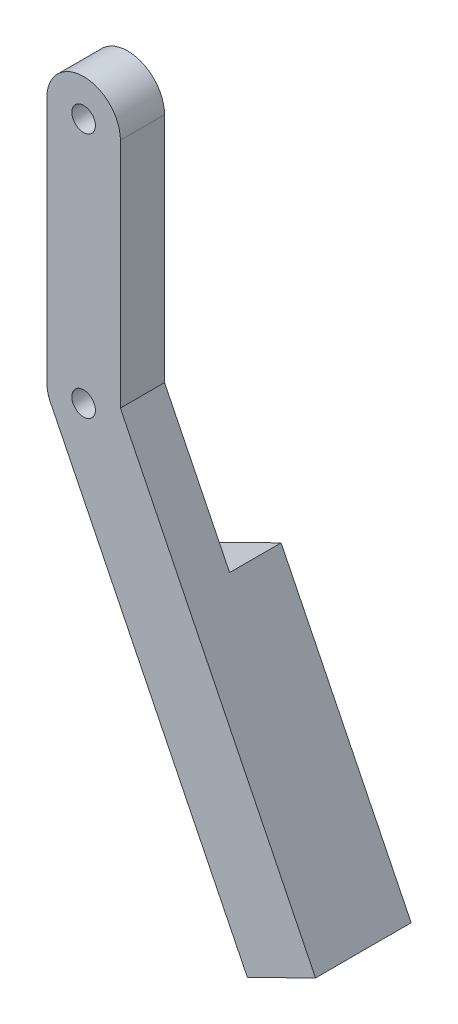
ISO-10303-21;
HEADER;
FILE_DESCRIPTION(('STEP AP214'),'2;1');
FILE_NAME('part.step','',(''),(''),'','','');
FILE_SCHEMA(('AUTOMOTIVE_DESIGN { 1 0 10303 214 1 1 1 1 }'));
ENDSEC;
DATA;
#1=APPLICATION_CONTEXT('core data for automotive mechanical design processes');
#2=APPLICATION_PROTOCOL_DEFINITION('international standard','automotive_design',2000,#1);
#3=PRODUCT_CONTEXT('',#1,'mechanical');
#4=PRODUCT('Part','Part','',(#3));
#5=PRODUCT_RELATED_PRODUCT_CATEGORY('part','',(#4));
#6=PRODUCT_DEFINITION_FORMATION('','',#4);
#7=PRODUCT_DEFINITION_CONTEXT('part definition',#1,'design');
#8=PRODUCT_DEFINITION('design','',#6,#7);
#9=PRODUCT_DEFINITION_SHAPE('','',#8);
#10=(LENGTH_UNIT() NAMED_UNIT(*) SI_UNIT(.MILLI.,.METRE.));
#11=(NAMED_UNIT(*) PLANE_ANGLE_UNIT() SI_UNIT($,.RADIAN.));
#12=(NAMED_UNIT(*) SI_UNIT($,.STERADIAN.) SOLID_ANGLE_UNIT());
#13=UNCERTAINTY_MEASURE_WITH_UNIT(LENGTH_MEASURE(1.E-05),#10,'distance_accuracy_value','');
#14=(GEOMETRIC_REPRESENTATION_CONTEXT(3) GLOBAL_UNCERTAINTY_ASSIGNED_CONTEXT((#13)) GLOBAL_UNIT_ASSIGNED_CONTEXT((#10,
#11,#12)) REPRESENTATION_CONTEXT('',''));
#15=CARTESIAN_POINT('',(0.,0.,0.));
#16=DIRECTION('',(0.,0.,1.));
#17=DIRECTION('',(1.,0.,0.));
#18=AXIS2_PLACEMENT_3D('',#15,#16,#17);
#19=CARTESIAN_POINT('',(0.,0.,0.));
#20=DIRECTION('',(0.,0.,1.));
#21=DIRECTION('',(1.,0.,0.));
#22=AXIS2_PLACEMENT_3D('',#19,#20,#21);
#23=PLANE('',#22);
#24=CARTESIAN_POINT('',(0.,0.,0.));
#25=DIRECTION('',(0.,0.,1.));
#26=DIRECTION('',(1.,0.,0.));
#27=AXIS2_PLACEMENT_3D('',#24,#25,#26);
#28=CIRCLE('',#27,1.6);
#29=CARTESIAN_POINT('',(1.6,0.,0.));
#30=VERTEX_POINT('',#29);
#31=EDGE_CURVE('E194',#30,#30,#28,.T.);
#32=ORIENTED_EDGE('',*,*,#31,.T.);
#33=EDGE_LOOP('',(#32));
#34=FACE_BOUND('',#33,.T.);
#35=CARTESIAN_POINT('',(0.,33.48,0.));
#36=DIRECTION('',(0.,0.,1.));
#37=DIRECTION('',(1.,0.,0.));
#38=AXIS2_PLACEMENT_3D('',#35,#36,#37);
#39=CIRCLE('',#38,1.6);
#40=CARTESIAN_POINT('',(1.6,33.48,0.));
#41=VERTEX_POINT('',#40);
#42=EDGE_CURVE('E142',#41,#41,#39,.T.);
#43=ORIENTED_EDGE('',*,*,#42,.T.);
#44=EDGE_LOOP('',(#43));
#45=FACE_BOUND('',#44,.T.);
#46=DIRECTION('',(0.897027074766714,0.441975595633369,0.));
#47=VECTOR('',#46,1.);
#48=CARTESIAN_POINT('',(13.8395119126674,-15.9905414953343,0.));
#49=LINE('',#48,#47);
#50=CARTESIAN_POINT('',(4.57706115389567,-20.5542579162657,0.));
#51=VERTEX_POINT('',#50);
#52=CARTESIAN_POINT('',(13.8395119126674,-15.9905414953343,0.));
#53=VERTEX_POINT('',#52);
#54=EDGE_CURVE('E56',#51,#53,#49,.T.);
#55=ORIENTED_EDGE('',*,*,#54,.F.);
#56=DIRECTION('',(0.44197559563337,-0.897027074766714,0.));
#57=VECTOR('',#56,1.);
#58=CARTESIAN_POINT('',(-4.46605794689399,-2.20047830967082,0.));
#59=LINE('',#58,#57);
#60=CARTESIAN_POINT('',(-4.26245075877173,-2.61371642093138,0.));
#61=VERTEX_POINT('',#60);
#62=EDGE_CURVE('E144',#61,#51,#59,.T.);
#63=ORIENTED_EDGE('',*,*,#62,.F.);
#64=CARTESIAN_POINT('',(0.,0.,0.));
#65=DIRECTION('',(0.,0.,1.));
#66=DIRECTION('',(1.,0.,0.));
#67=AXIS2_PLACEMENT_3D('',#64,#65,#66);
#68=CIRCLE('',#67,5.);
#69=CARTESIAN_POINT('',(-5.,0.,0.));
#70=VERTEX_POINT('',#69);
#71=EDGE_CURVE('E141',#70,#61,#68,.T.);
#72=ORIENTED_EDGE('',*,*,#71,.F.);
#73=DIRECTION('',(0.,-1.,0.));
#74=VECTOR('',#73,1.);
#75=CARTESIAN_POINT('',(-5.,0.,0.));
#76=LINE('',#75,#74);
#77=CARTESIAN_POINT('',(-5.,33.48,0.));
#78=VERTEX_POINT('',#77);
#79=EDGE_CURVE('E138',#78,#70,#76,.T.);
#80=ORIENTED_EDGE('',*,*,#79,.F.);
#81=CARTESIAN_POINT('',(0.,33.48,0.));
#82=DIRECTION('',(0.,0.,1.));
#83=DIRECTION('',(1.,0.,0.));
#84=AXIS2_PLACEMENT_3D('',#81,#82,#83);
#85=CIRCLE('',#84,5.);
#86=CARTESIAN_POINT('',(5.,33.48,0.));
#87=VERTEX_POINT('',#86);
#88=EDGE_CURVE('E89',#87,#78,#85,.T.);
#89=ORIENTED_EDGE('',*,*,#88,.F.);
#90=DIRECTION('',(0.,-1.,0.));
#91=VECTOR('',#90,1.);
#92=CARTESIAN_POINT('',(5.,0.,0.));
#93=LINE('',#92,#91);
#94=CARTESIAN_POINT('',(5.,1.95,0.));
#95=VERTEX_POINT('',#94);
#96=EDGE_CURVE('E147',#87,#95,#93,.T.);
#97=ORIENTED_EDGE('',*,*,#96,.T.);
#98=DIRECTION('',(0.44197559563337,-0.897027074766714,0.));
#99=VECTOR('',#98,1.);
#100=CARTESIAN_POINT('',(4.79639281187774,2.36323811126056,0.));
#101=LINE('',#100,#99);
#102=EDGE_CURVE('E118',#95,#53,#101,.T.);
#103=ORIENTED_EDGE('',*,*,#102,.T.);
#104=EDGE_LOOP('',(#55,#63,#72,#80,#89,#97,#103));
#105=FACE_BOUND('',#104,.T.);
#106=ADVANCED_FACE('F41',(#34,#45,#105),#23,.F.);
#107=CARTESIAN_POINT('',(-5.,0.,6.));
#108=DIRECTION('',(1.,0.,0.));
#109=DIRECTION('',(0.,1.,0.));
#110=AXIS2_PLACEMENT_3D('',#107,#108,#109);
#111=PLANE('',#110);
#112=ORIENTED_EDGE('',*,*,#79,.T.);
#113=DIRECTION('',(0.,0.,-1.));
#114=VECTOR('',#113,1.);
#115=CARTESIAN_POINT('',(-5.,0.,6.));
#116=LINE('',#115,#114);
#117=CARTESIAN_POINT('',(-5.,0.,6.));
#118=VERTEX_POINT('',#117);
#119=EDGE_CURVE('E11',#118,#70,#116,.T.);
#120=ORIENTED_EDGE('',*,*,#119,.F.);
#121=DIRECTION('',(0.,-1.,0.));
#122=VECTOR('',#121,1.);
#123=CARTESIAN_POINT('',(-5.,0.,6.));
#124=LINE('',#123,#122);
#125=CARTESIAN_POINT('',(-5.,33.48,6.));
#126=VERTEX_POINT('',#125);
#127=EDGE_CURVE('E150',#126,#118,#124,.T.);
#128=ORIENTED_EDGE('',*,*,#127,.F.);
#129=DIRECTION('',(0.,0.,-1.));
#130=VECTOR('',#129,1.);
#131=CARTESIAN_POINT('',(-5.,33.48,6.));
#132=LINE('',#131,#130);
#133=EDGE_CURVE('E134',#126,#78,#132,.T.);
#134=ORIENTED_EDGE('',*,*,#133,.T.);
#135=EDGE_LOOP('',(#112,#120,#128,#134));
#136=FACE_BOUND('',#135,.T.);
#137=ADVANCED_FACE('F43',(#136),#111,.F.);
#138=CARTESIAN_POINT('',(0.,0.,6.));
#139=DIRECTION('',(0.,0.,-1.));
#140=DIRECTION('',(-1.,0.,0.));
#141=AXIS2_PLACEMENT_3D('',#138,#139,#140);
#142=CYLINDRICAL_SURFACE('',#141,5.);
#143=ORIENTED_EDGE('',*,*,#71,.T.);
#144=DIRECTION('',(0.,0.,-1.));
#145=VECTOR('',#144,1.);
#146=CARTESIAN_POINT('',(-4.26245075877173,-2.61371642093138,6.));
#147=LINE('',#146,#145);
#148=CARTESIAN_POINT('',(-4.26245075877173,-2.61371642093138,6.));
#149=VERTEX_POINT('',#148);
#150=EDGE_CURVE('E49',#149,#61,#147,.T.);
#151=ORIENTED_EDGE('',*,*,#150,.F.);
#152=CARTESIAN_POINT('',(0.,0.,6.));
#153=DIRECTION('',(0.,0.,1.));
#154=DIRECTION('',(1.,0.,0.));
#155=AXIS2_PLACEMENT_3D('',#152,#153,#154);
#156=CIRCLE('',#155,5.);
#157=EDGE_CURVE('E97',#118,#149,#156,.T.);
#158=ORIENTED_EDGE('',*,*,#157,.F.);
#159=ORIENTED_EDGE('',*,*,#119,.T.);
#160=EDGE_LOOP('',(#143,#151,#158,#159));
#161=FACE_BOUND('',#160,.T.);
#162=ADVANCED_FACE('F166',(#161),#142,.T.);
#163=CARTESIAN_POINT('',(-4.46605794689399,-2.20047830967082,6.));
#164=DIRECTION('',(0.897027074766714,0.44197559563337,0.));
#165=DIRECTION('',(-0.44197559563337,0.897027074766714,0.));
#166=AXIS2_PLACEMENT_3D('',#163,#164,#165);
#167=PLANE('',#166);
#168=ORIENTED_EDGE('',*,*,#62,.T.);
#169=DIRECTION('',(0.,0.,1.));
#170=VECTOR('',#169,1.);
#171=CARTESIAN_POINT('',(4.57706115389571,-20.5542579162656,-7.));
#172=LINE('',#171,#170);
#173=CARTESIAN_POINT('',(4.57706115389571,-20.5542579162656,-7.));
#174=VERTEX_POINT('',#173);
#175=EDGE_CURVE('E177',#174,#51,#172,.T.);
#176=ORIENTED_EDGE('',*,*,#175,.F.);
#177=DIRECTION('',(-0.441975595633369,0.897027074766714,0.));
#178=VECTOR('',#177,1.);
#179=CARTESIAN_POINT('',(22.2560849792305,-56.4353409069342,-7.));
#180=LINE('',#179,#178);
#181=CARTESIAN_POINT('',(22.2560849792305,-56.4353409069342,-7.));
#182=VERTEX_POINT('',#181);
#183=EDGE_CURVE('E186',#182,#174,#180,.T.);
#184=ORIENTED_EDGE('',*,*,#183,.F.);
#185=DIRECTION('',(0.,0.,-1.));
#186=VECTOR('',#185,1.);
#187=CARTESIAN_POINT('',(22.2560849792305,-56.4353409069342,6.));
#188=LINE('',#187,#186);
#189=CARTESIAN_POINT('',(22.2560849792305,-56.4353409069342,6.));
#190=VERTEX_POINT('',#189);
#191=EDGE_CURVE('E154',#190,#182,#188,.T.);
#192=ORIENTED_EDGE('',*,*,#191,.F.);
#193=DIRECTION('',(0.44197559563337,-0.897027074766714,0.));
#194=VECTOR('',#193,1.);
#195=CARTESIAN_POINT('',(-4.46605794689399,-2.20047830967082,6.));
#196=LINE('',#195,#194);
#197=EDGE_CURVE('E163',#149,#190,#196,.T.);
#198=ORIENTED_EDGE('',*,*,#197,.F.);
#199=ORIENTED_EDGE('',*,*,#150,.T.);
#200=EDGE_LOOP('',(#168,#176,#184,#192,#198,#199));
#201=FACE_BOUND('',#200,.T.);
#202=ADVANCED_FACE('F159',(#201),#167,.F.);
#203=CARTESIAN_POINT('',(26.7221429261244,-54.2348625972634,6.));
#204=DIRECTION('',(0.441975595633369,-0.897027074766714,0.));
#205=DIRECTION('',(0.897027074766714,0.441975595633369,0.));
#206=AXIS2_PLACEMENT_3D('',#203,#204,#205);
#207=PLANE('',#206);
#208=ORIENTED_EDGE('',*,*,#191,.T.);
#209=DIRECTION('',(-0.897027074766714,-0.441975595633369,0.));
#210=VECTOR('',#209,1.);
#211=CARTESIAN_POINT('',(31.5185357380022,-51.8716244860028,-7.));
#212=LINE('',#211,#210);
#213=CARTESIAN_POINT('',(31.5185357380022,-51.8716244860028,-7.));
#214=VERTEX_POINT('',#213);
#215=EDGE_CURVE('E206',#214,#182,#212,.T.);
#216=ORIENTED_EDGE('',*,*,#215,.F.);
#217=DIRECTION('',(0.,0.,-1.));
#218=VECTOR('',#217,1.);
#219=CARTESIAN_POINT('',(31.5185357380022,-51.8716244860028,6.));
#220=LINE('',#219,#218);
#221=CARTESIAN_POINT('',(31.5185357380022,-51.8716244860028,6.));
#222=VERTEX_POINT('',#221);
#223=EDGE_CURVE('E123',#222,#214,#220,.T.);
#224=ORIENTED_EDGE('',*,*,#223,.F.);
#225=DIRECTION('',(-0.897027074766714,-0.441975595633369,0.));
#226=VECTOR('',#225,1.);
#227=CARTESIAN_POINT('',(26.7221429261244,-54.2348625972634,6.));
#228=LINE('',#227,#226);
#229=EDGE_CURVE('E130',#222,#190,#228,.T.);
#230=ORIENTED_EDGE('',*,*,#229,.T.);
#231=EDGE_LOOP('',(#208,#216,#224,#230));
#232=FACE_BOUND('',#231,.T.);
#233=ADVANCED_FACE('F202',(#232),#207,.T.);
#234=CARTESIAN_POINT('',(4.79639281187774,2.36323811126056,6.));
#235=DIRECTION('',(0.897027074766714,0.44197559563337,0.));
#236=DIRECTION('',(-0.44197559563337,0.897027074766714,0.));
#237=AXIS2_PLACEMENT_3D('',#234,#235,#236);
#238=PLANE('',#237);
#239=ORIENTED_EDGE('',*,*,#102,.F.);
#240=DIRECTION('',(0.,0.,-1.));
#241=VECTOR('',#240,1.);
#242=CARTESIAN_POINT('',(5.,1.95,6.));
#243=LINE('',#242,#241);
#244=CARTESIAN_POINT('',(5.,1.95,6.));
#245=VERTEX_POINT('',#244);
#246=EDGE_CURVE('E112',#245,#95,#243,.T.);
#247=ORIENTED_EDGE('',*,*,#246,.F.);
#248=DIRECTION('',(0.44197559563337,-0.897027074766714,0.));
#249=VECTOR('',#248,1.);
#250=CARTESIAN_POINT('',(4.79639281187774,2.36323811126056,6.));
#251=LINE('',#250,#249);
#252=EDGE_CURVE('E116',#245,#222,#251,.T.);
#253=ORIENTED_EDGE('',*,*,#252,.T.);
#254=ORIENTED_EDGE('',*,*,#223,.T.);
#255=DIRECTION('',(0.441975595633369,-0.897027074766714,0.));
#256=VECTOR('',#255,1.);
#257=CARTESIAN_POINT('',(31.5185357380022,-51.8716244860028,-7.));
#258=LINE('',#257,#256);
#259=CARTESIAN_POINT('',(13.8395119126674,-15.9905414953343,-7.));
#260=VERTEX_POINT('',#259);
#261=EDGE_CURVE('E178',#260,#214,#258,.T.);
#262=ORIENTED_EDGE('',*,*,#261,.F.);
#263=DIRECTION('',(0.,0.,1.));
#264=VECTOR('',#263,1.);
#265=CARTESIAN_POINT('',(13.8395119126674,-15.9905414953343,-7.));
#266=LINE('',#265,#264);
#267=EDGE_CURVE('E175',#260,#53,#266,.T.);
#268=ORIENTED_EDGE('',*,*,#267,.T.);
#269=EDGE_LOOP('',(#239,#247,#253,#254,#262,#268));
#270=FACE_BOUND('',#269,.T.);
#271=ADVANCED_FACE('F114',(#270),#238,.T.);
#272=CARTESIAN_POINT('',(5.,0.,6.));
#273=DIRECTION('',(1.,0.,0.));
#274=DIRECTION('',(0.,1.,0.));
#275=AXIS2_PLACEMENT_3D('',#272,#273,#274);
#276=PLANE('',#275);
#277=ORIENTED_EDGE('',*,*,#96,.F.);
#278=DIRECTION('',(0.,0.,-1.));
#279=VECTOR('',#278,1.);
#280=CARTESIAN_POINT('',(5.,33.48,6.));
#281=LINE('',#280,#279);
#282=CARTESIAN_POINT('',(5.,33.48,6.));
#283=VERTEX_POINT('',#282);
#284=EDGE_CURVE('E124',#283,#87,#281,.T.);
#285=ORIENTED_EDGE('',*,*,#284,.F.);
#286=DIRECTION('',(0.,-1.,0.));
#287=VECTOR('',#286,1.);
#288=CARTESIAN_POINT('',(5.,0.,6.));
#289=LINE('',#288,#287);
#290=EDGE_CURVE('E128',#283,#245,#289,.T.);
#291=ORIENTED_EDGE('',*,*,#290,.T.);
#292=ORIENTED_EDGE('',*,*,#246,.T.);
#293=EDGE_LOOP('',(#277,#285,#291,#292));
#294=FACE_BOUND('',#293,.T.);
#295=ADVANCED_FACE('F132',(#294),#276,.T.);
#296=CARTESIAN_POINT('',(0.,33.48,6.));
#297=DIRECTION('',(0.,0.,-1.));
#298=DIRECTION('',(-1.,0.,0.));
#299=AXIS2_PLACEMENT_3D('',#296,#297,#298);
#300=CYLINDRICAL_SURFACE('',#299,5.);
#301=ORIENTED_EDGE('',*,*,#88,.T.);
#302=ORIENTED_EDGE('',*,*,#133,.F.);
#303=CARTESIAN_POINT('',(0.,33.48,6.));
#304=DIRECTION('',(0.,0.,1.));
#305=DIRECTION('',(1.,0.,0.));
#306=AXIS2_PLACEMENT_3D('',#303,#304,#305);
#307=CIRCLE('',#306,5.);
#308=EDGE_CURVE('E65',#283,#126,#307,.T.);
#309=ORIENTED_EDGE('',*,*,#308,.F.);
#310=ORIENTED_EDGE('',*,*,#284,.T.);
#311=EDGE_LOOP('',(#301,#302,#309,#310));
#312=FACE_BOUND('',#311,.T.);
#313=ADVANCED_FACE('F169',(#312),#300,.T.);
#314=CARTESIAN_POINT('',(0.,0.,6.));
#315=DIRECTION('',(0.,0.,1.));
#316=DIRECTION('',(1.,0.,0.));
#317=AXIS2_PLACEMENT_3D('',#314,#315,#316);
#318=PLANE('',#317);
#319=CARTESIAN_POINT('',(0.,33.48,6.));
#320=DIRECTION('',(0.,0.,1.));
#321=DIRECTION('',(1.,0.,0.));
#322=AXIS2_PLACEMENT_3D('',#319,#320,#321);
#323=CIRCLE('',#322,1.6);
#324=CARTESIAN_POINT('',(1.6,33.48,6.));
#325=VERTEX_POINT('',#324);
#326=EDGE_CURVE('E191',#325,#325,#323,.T.);
#327=ORIENTED_EDGE('',*,*,#326,.F.);
#328=EDGE_LOOP('',(#327));
#329=FACE_BOUND('',#328,.T.);
#330=CARTESIAN_POINT('',(0.,0.,6.));
#331=DIRECTION('',(0.,0.,1.));
#332=DIRECTION('',(1.,0.,0.));
#333=AXIS2_PLACEMENT_3D('',#330,#331,#332);
#334=CIRCLE('',#333,1.6);
#335=CARTESIAN_POINT('',(1.6,0.,6.));
#336=VERTEX_POINT('',#335);
#337=EDGE_CURVE('E183',#336,#336,#334,.T.);
#338=ORIENTED_EDGE('',*,*,#337,.F.);
#339=EDGE_LOOP('',(#338));
#340=FACE_BOUND('',#339,.T.);
#341=ORIENTED_EDGE('',*,*,#127,.T.);
#342=ORIENTED_EDGE('',*,*,#157,.T.);
#343=ORIENTED_EDGE('',*,*,#197,.T.);
#344=ORIENTED_EDGE('',*,*,#229,.F.);
#345=ORIENTED_EDGE('',*,*,#252,.F.);
#346=ORIENTED_EDGE('',*,*,#290,.F.);
#347=ORIENTED_EDGE('',*,*,#308,.T.);
#348=EDGE_LOOP('',(#341,#342,#343,#344,#345,#346,#347));
#349=FACE_BOUND('',#348,.T.);
#350=ADVANCED_FACE('F127',(#329,#340,#349),#318,.T.);
#351=CARTESIAN_POINT('',(0.,0.,0.));
#352=DIRECTION('',(0.,0.,1.));
#353=DIRECTION('',(1.,0.,0.));
#354=AXIS2_PLACEMENT_3D('',#351,#352,#353);
#355=CYLINDRICAL_SURFACE('',#354,1.6);
#356=ORIENTED_EDGE('',*,*,#31,.F.);
#357=EDGE_LOOP('',(#356));
#358=FACE_BOUND('',#357,.T.);
#359=ORIENTED_EDGE('',*,*,#337,.T.);
#360=EDGE_LOOP('',(#359));
#361=FACE_BOUND('',#360,.T.);
#362=ADVANCED_FACE('F276',(#358,#361),#355,.F.);
#363=CARTESIAN_POINT('',(0.,33.48,0.));
#364=DIRECTION('',(0.,0.,1.));
#365=DIRECTION('',(1.,0.,0.));
#366=AXIS2_PLACEMENT_3D('',#363,#364,#365);
#367=CYLINDRICAL_SURFACE('',#366,1.6);
#368=ORIENTED_EDGE('',*,*,#42,.F.);
#369=EDGE_LOOP('',(#368));
#370=FACE_BOUND('',#369,.T.);
#371=ORIENTED_EDGE('',*,*,#326,.T.);
#372=EDGE_LOOP('',(#371));
#373=FACE_BOUND('',#372,.T.);
#374=ADVANCED_FACE('F223',(#370,#373),#367,.F.);
#375=CARTESIAN_POINT('',(13.8395119126674,-15.9905414953343,-7.));
#376=DIRECTION('',(0.441975595633369,-0.897027074766714,0.));
#377=DIRECTION('',(0.897027074766714,0.441975595633369,0.));
#378=AXIS2_PLACEMENT_3D('',#375,#376,#377);
#379=PLANE('',#378);
#380=ORIENTED_EDGE('',*,*,#54,.T.);
#381=ORIENTED_EDGE('',*,*,#267,.F.);
#382=DIRECTION('',(0.897027074766714,0.441975595633369,0.));
#383=VECTOR('',#382,1.);
#384=CARTESIAN_POINT('',(13.8395119126674,-15.9905414953343,-7.));
#385=LINE('',#384,#383);
#386=EDGE_CURVE('E181',#174,#260,#385,.T.);
#387=ORIENTED_EDGE('',*,*,#386,.F.);
#388=ORIENTED_EDGE('',*,*,#175,.T.);
#389=EDGE_LOOP('',(#380,#381,#387,#388));
#390=FACE_BOUND('',#389,.T.);
#391=ADVANCED_FACE('F173',(#390),#379,.F.);
#392=CARTESIAN_POINT('',(0.,0.,-7.));
#393=DIRECTION('',(0.,0.,1.));
#394=DIRECTION('',(1.,0.,0.));
#395=AXIS2_PLACEMENT_3D('',#392,#393,#394);
#396=PLANE('',#395);
#397=ORIENTED_EDGE('',*,*,#261,.T.);
#398=ORIENTED_EDGE('',*,*,#215,.T.);
#399=ORIENTED_EDGE('',*,*,#183,.T.);
#400=ORIENTED_EDGE('',*,*,#386,.T.);
#401=EDGE_LOOP('',(#397,#398,#399,#400));
#402=FACE_BOUND('',#401,.T.);
#403=ADVANCED_FACE('F213',(#402),#396,.F.);
#404=CLOSED_SHELL('',(#106,#137,#162,#202,#233,#271,#295,#313,#350,#362,#374,#391,#403));
#405=MANIFOLD_SOLID_BREP('B2',#404);
#406=ADVANCED_BREP_SHAPE_REPRESENTATION('',(#18,#405),#14);
#407=SHAPE_DEFINITION_REPRESENTATION(#9,#406);
ENDSEC;
END-ISO-10303-21;
